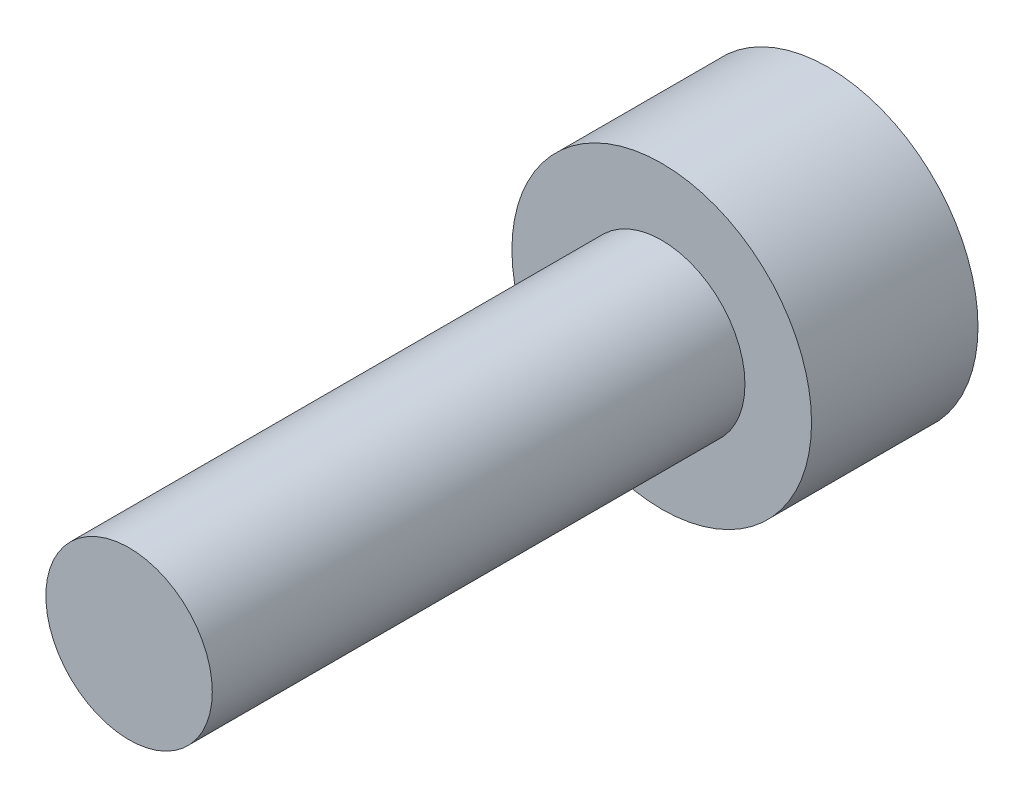
ISO-10303-21;
HEADER;
FILE_DESCRIPTION(('STEP AP214'),'2;1');
FILE_NAME('part.step','',(''),(''),'','','');
FILE_SCHEMA(('AUTOMOTIVE_DESIGN { 1 0 10303 214 1 1 1 1 }'));
ENDSEC;
DATA;
#1=APPLICATION_CONTEXT('core data for automotive mechanical design processes');
#2=APPLICATION_PROTOCOL_DEFINITION('international standard','automotive_design',2000,#1);
#3=PRODUCT_CONTEXT('',#1,'mechanical');
#4=PRODUCT('Part','Part','',(#3));
#5=PRODUCT_RELATED_PRODUCT_CATEGORY('part','',(#4));
#6=PRODUCT_DEFINITION_FORMATION('','',#4);
#7=PRODUCT_DEFINITION_CONTEXT('part definition',#1,'design');
#8=PRODUCT_DEFINITION('design','',#6,#7);
#9=PRODUCT_DEFINITION_SHAPE('','',#8);
#10=(LENGTH_UNIT() NAMED_UNIT(*) SI_UNIT(.MILLI.,.METRE.));
#11=(NAMED_UNIT(*) PLANE_ANGLE_UNIT() SI_UNIT($,.RADIAN.));
#12=(NAMED_UNIT(*) SI_UNIT($,.STERADIAN.) SOLID_ANGLE_UNIT());
#13=UNCERTAINTY_MEASURE_WITH_UNIT(LENGTH_MEASURE(1.E-05),#10,'distance_accuracy_value','');
#14=(GEOMETRIC_REPRESENTATION_CONTEXT(3) GLOBAL_UNCERTAINTY_ASSIGNED_CONTEXT((#13)) GLOBAL_UNIT_ASSIGNED_CONTEXT((#10,
#11,#12)) REPRESENTATION_CONTEXT('',''));
#15=CARTESIAN_POINT('',(0.,0.,0.));
#16=DIRECTION('',(0.,0.,1.));
#17=DIRECTION('',(1.,0.,0.));
#18=AXIS2_PLACEMENT_3D('',#15,#16,#17);
#19=CARTESIAN_POINT('',(0.,0.,2.5));
#20=DIRECTION('',(0.,0.,1.));
#21=DIRECTION('',(1.,0.,0.));
#22=AXIS2_PLACEMENT_3D('',#19,#20,#21);
#23=PLANE('',#22);
#24=CARTESIAN_POINT('',(0.,0.,2.5));
#25=DIRECTION('',(0.,0.,1.));
#26=DIRECTION('',(1.,0.,0.));
#27=AXIS2_PLACEMENT_3D('',#24,#25,#26);
#28=CIRCLE('',#27,2.25);
#29=CARTESIAN_POINT('',(2.25,0.,2.5));
#30=VERTEX_POINT('',#29);
#31=EDGE_CURVE('E11',#30,#30,#28,.T.);
#32=ORIENTED_EDGE('',*,*,#31,.T.);
#33=EDGE_LOOP('',(#32));
#34=FACE_BOUND('',#33,.T.);
#35=CARTESIAN_POINT('',(0.,0.,2.5));
#36=DIRECTION('',(0.,0.,1.));
#37=DIRECTION('',(1.,0.,0.));
#38=AXIS2_PLACEMENT_3D('',#35,#36,#37);
#39=CIRCLE('',#38,1.25);
#40=CARTESIAN_POINT('',(1.25,0.,2.5));
#41=VERTEX_POINT('',#40);
#42=EDGE_CURVE('E139',#41,#41,#39,.T.);
#43=ORIENTED_EDGE('',*,*,#42,.F.);
#44=EDGE_LOOP('',(#43));
#45=FACE_BOUND('',#44,.T.);
#46=ADVANCED_FACE('F37',(#34,#45),#23,.T.);
#47=CARTESIAN_POINT('',(0.,0.,2.5));
#48=DIRECTION('',(0.,0.,-1.));
#49=DIRECTION('',(-1.,0.,0.));
#50=AXIS2_PLACEMENT_3D('',#47,#48,#49);
#51=CYLINDRICAL_SURFACE('',#50,2.25);
#52=ORIENTED_EDGE('',*,*,#31,.F.);
#53=EDGE_LOOP('',(#52));
#54=FACE_BOUND('',#53,.T.);
#55=CARTESIAN_POINT('',(0.,0.,0.));
#56=DIRECTION('',(0.,0.,1.));
#57=DIRECTION('',(1.,0.,0.));
#58=AXIS2_PLACEMENT_3D('',#55,#56,#57);
#59=CIRCLE('',#58,2.25);
#60=CARTESIAN_POINT('',(2.25,0.,0.));
#61=VERTEX_POINT('',#60);
#62=EDGE_CURVE('E41',#61,#61,#59,.T.);
#63=ORIENTED_EDGE('',*,*,#62,.T.);
#64=EDGE_LOOP('',(#63));
#65=FACE_BOUND('',#64,.T.);
#66=ADVANCED_FACE('F39',(#54,#65),#51,.T.);
#67=CARTESIAN_POINT('',(0.,0.,0.));
#68=DIRECTION('',(0.,0.,1.));
#69=DIRECTION('',(1.,0.,0.));
#70=AXIS2_PLACEMENT_3D('',#67,#68,#69);
#71=PLANE('',#70);
#72=DIRECTION('',(-0.205557637970208,0.978645010957553,0.));
#73=VECTOR('',#72,1.);
#74=CARTESIAN_POINT('',(-0.852242502162426,-0.763657678817253,0.));
#75=LINE('',#74,#73);
#76=CARTESIAN_POINT('',(-0.852242502162426,-0.763657678817253,0.));
#77=VERTEX_POINT('',#76);
#78=CARTESIAN_POINT('',(-1.08746820073201,0.356234817648851,0.));
#79=VERTEX_POINT('',#78);
#80=EDGE_CURVE('E126',#77,#79,#75,.T.);
#81=ORIENTED_EDGE('',*,*,#80,.F.);
#82=DIRECTION('',(-0.950310259761245,0.311304369054652,0.));
#83=VECTOR('',#82,1.);
#84=CARTESIAN_POINT('',(0.235225698569587,-1.1198924964661,0.));
#85=LINE('',#84,#83);
#86=CARTESIAN_POINT('',(0.235225698569587,-1.1198924964661,0.));
#87=VERTEX_POINT('',#86);
#88=EDGE_CURVE('E52',#87,#77,#85,.T.);
#89=ORIENTED_EDGE('',*,*,#88,.F.);
#90=DIRECTION('',(-0.744752621791037,-0.667340641902901,0.));
#91=VECTOR('',#90,1.);
#92=CARTESIAN_POINT('',(1.08746820073201,-0.356234817648848,0.));
#93=LINE('',#92,#91);
#94=CARTESIAN_POINT('',(1.08746820073201,-0.356234817648848,0.));
#95=VERTEX_POINT('',#94);
#96=EDGE_CURVE('E135',#95,#87,#93,.T.);
#97=ORIENTED_EDGE('',*,*,#96,.F.);
#98=DIRECTION('',(0.205557637970207,-0.978645010957553,0.));
#99=VECTOR('',#98,1.);
#100=CARTESIAN_POINT('',(0.852242502162427,0.763657678817255,0.));
#101=LINE('',#100,#99);
#102=CARTESIAN_POINT('',(0.852242502162427,0.763657678817255,0.));
#103=VERTEX_POINT('',#102);
#104=EDGE_CURVE('E133',#103,#95,#101,.T.);
#105=ORIENTED_EDGE('',*,*,#104,.F.);
#106=DIRECTION('',(0.950310259761245,-0.311304369054652,0.));
#107=VECTOR('',#106,1.);
#108=CARTESIAN_POINT('',(-0.235225698569587,1.1198924964661,0.));
#109=LINE('',#108,#107);
#110=CARTESIAN_POINT('',(-0.235225698569587,1.1198924964661,0.));
#111=VERTEX_POINT('',#110);
#112=EDGE_CURVE('E100',#111,#103,#109,.T.);
#113=ORIENTED_EDGE('',*,*,#112,.F.);
#114=DIRECTION('',(0.744752621791037,0.667340641902901,0.));
#115=VECTOR('',#114,1.);
#116=CARTESIAN_POINT('',(-1.08746820073201,0.356234817648851,0.));
#117=LINE('',#116,#115);
#118=EDGE_CURVE('E129',#79,#111,#117,.T.);
#119=ORIENTED_EDGE('',*,*,#118,.F.);
#120=EDGE_LOOP('',(#81,#89,#97,#105,#113,#119));
#121=FACE_BOUND('',#120,.T.);
#122=ORIENTED_EDGE('',*,*,#62,.F.);
#123=EDGE_LOOP('',(#122));
#124=FACE_BOUND('',#123,.T.);
#125=ADVANCED_FACE('F159',(#121,#124),#71,.F.);
#126=CARTESIAN_POINT('',(0.,0.,10.5));
#127=DIRECTION('',(0.,0.,-1.));
#128=DIRECTION('',(-1.,0.,0.));
#129=AXIS2_PLACEMENT_3D('',#126,#127,#128);
#130=CYLINDRICAL_SURFACE('',#129,1.25);
#131=CARTESIAN_POINT('',(0.,0.,10.5));
#132=DIRECTION('',(0.,0.,1.));
#133=DIRECTION('',(1.,0.,0.));
#134=AXIS2_PLACEMENT_3D('',#131,#132,#133);
#135=CIRCLE('',#134,1.25);
#136=CARTESIAN_POINT('',(1.25,0.,10.5));
#137=VERTEX_POINT('',#136);
#138=EDGE_CURVE('E145',#137,#137,#135,.T.);
#139=ORIENTED_EDGE('',*,*,#138,.F.);
#140=EDGE_LOOP('',(#139));
#141=FACE_BOUND('',#140,.T.);
#142=ORIENTED_EDGE('',*,*,#42,.T.);
#143=EDGE_LOOP('',(#142));
#144=FACE_BOUND('',#143,.T.);
#145=ADVANCED_FACE('F151',(#141,#144),#130,.T.);
#146=CARTESIAN_POINT('',(0.,0.,10.5));
#147=DIRECTION('',(0.,0.,1.));
#148=DIRECTION('',(1.,0.,0.));
#149=AXIS2_PLACEMENT_3D('',#146,#147,#148);
#150=PLANE('',#149);
#151=ORIENTED_EDGE('',*,*,#138,.T.);
#152=EDGE_LOOP('',(#151));
#153=FACE_BOUND('',#152,.T.);
#154=ADVANCED_FACE('F168',(#153),#150,.T.);
#155=CARTESIAN_POINT('',(0.235225698569587,-1.1198924964661,2.));
#156=DIRECTION('',(-0.311304369054652,-0.950310259761245,0.));
#157=DIRECTION('',(0.950310259761245,-0.311304369054652,0.));
#158=AXIS2_PLACEMENT_3D('',#155,#156,#157);
#159=PLANE('',#158);
#160=ORIENTED_EDGE('',*,*,#88,.T.);
#161=DIRECTION('',(0.,0.,-1.));
#162=VECTOR('',#161,1.);
#163=CARTESIAN_POINT('',(-0.852242502162426,-0.763657678817253,2.));
#164=LINE('',#163,#162);
#165=CARTESIAN_POINT('',(-0.852242502162426,-0.763657678817253,2.));
#166=VERTEX_POINT('',#165);
#167=EDGE_CURVE('E82',#166,#77,#164,.T.);
#168=ORIENTED_EDGE('',*,*,#167,.F.);
#169=DIRECTION('',(-0.950310259761245,0.311304369054652,0.));
#170=VECTOR('',#169,1.);
#171=CARTESIAN_POINT('',(0.235225698569587,-1.1198924964661,2.));
#172=LINE('',#171,#170);
#173=CARTESIAN_POINT('',(0.235225698569587,-1.1198924964661,2.));
#174=VERTEX_POINT('',#173);
#175=EDGE_CURVE('E137',#174,#166,#172,.T.);
#176=ORIENTED_EDGE('',*,*,#175,.F.);
#177=DIRECTION('',(0.,0.,-1.));
#178=VECTOR('',#177,1.);
#179=CARTESIAN_POINT('',(0.235225698569587,-1.1198924964661,2.));
#180=LINE('',#179,#178);
#181=EDGE_CURVE('E60',#174,#87,#180,.T.);
#182=ORIENTED_EDGE('',*,*,#181,.T.);
#183=EDGE_LOOP('',(#160,#168,#176,#182));
#184=FACE_BOUND('',#183,.T.);
#185=ADVANCED_FACE('F180',(#184),#159,.F.);
#186=CARTESIAN_POINT('',(1.08746820073201,-0.356234817648848,2.));
#187=DIRECTION('',(0.667340641902901,-0.744752621791037,0.));
#188=DIRECTION('',(0.744752621791037,0.667340641902901,0.));
#189=AXIS2_PLACEMENT_3D('',#186,#187,#188);
#190=PLANE('',#189);
#191=ORIENTED_EDGE('',*,*,#96,.T.);
#192=ORIENTED_EDGE('',*,*,#181,.F.);
#193=DIRECTION('',(-0.744752621791037,-0.667340641902901,0.));
#194=VECTOR('',#193,1.);
#195=CARTESIAN_POINT('',(1.08746820073201,-0.356234817648848,2.));
#196=LINE('',#195,#194);
#197=CARTESIAN_POINT('',(1.08746820073201,-0.356234817648848,2.));
#198=VERTEX_POINT('',#197);
#199=EDGE_CURVE('E112',#198,#174,#196,.T.);
#200=ORIENTED_EDGE('',*,*,#199,.F.);
#201=DIRECTION('',(0.,0.,-1.));
#202=VECTOR('',#201,1.);
#203=CARTESIAN_POINT('',(1.08746820073201,-0.356234817648848,2.));
#204=LINE('',#203,#202);
#205=EDGE_CURVE('E104',#198,#95,#204,.T.);
#206=ORIENTED_EDGE('',*,*,#205,.T.);
#207=EDGE_LOOP('',(#191,#192,#200,#206));
#208=FACE_BOUND('',#207,.T.);
#209=ADVANCED_FACE('F182',(#208),#190,.F.);
#210=CARTESIAN_POINT('',(0.852242502162427,0.763657678817255,2.));
#211=DIRECTION('',(0.978645010957553,0.205557637970207,0.));
#212=DIRECTION('',(-0.205557637970207,0.978645010957553,0.));
#213=AXIS2_PLACEMENT_3D('',#210,#211,#212);
#214=PLANE('',#213);
#215=ORIENTED_EDGE('',*,*,#104,.T.);
#216=ORIENTED_EDGE('',*,*,#205,.F.);
#217=DIRECTION('',(0.205557637970207,-0.978645010957553,0.));
#218=VECTOR('',#217,1.);
#219=CARTESIAN_POINT('',(0.852242502162427,0.763657678817255,2.));
#220=LINE('',#219,#218);
#221=CARTESIAN_POINT('',(0.852242502162427,0.763657678817255,2.));
#222=VERTEX_POINT('',#221);
#223=EDGE_CURVE('E108',#222,#198,#220,.T.);
#224=ORIENTED_EDGE('',*,*,#223,.F.);
#225=DIRECTION('',(0.,0.,-1.));
#226=VECTOR('',#225,1.);
#227=CARTESIAN_POINT('',(0.852242502162427,0.763657678817255,2.));
#228=LINE('',#227,#226);
#229=EDGE_CURVE('E93',#222,#103,#228,.T.);
#230=ORIENTED_EDGE('',*,*,#229,.T.);
#231=EDGE_LOOP('',(#215,#216,#224,#230));
#232=FACE_BOUND('',#231,.T.);
#233=ADVANCED_FACE('F109',(#232),#214,.F.);
#234=CARTESIAN_POINT('',(-0.235225698569587,1.1198924964661,2.));
#235=DIRECTION('',(0.311304369054652,0.950310259761245,0.));
#236=DIRECTION('',(-0.950310259761245,0.311304369054652,0.));
#237=AXIS2_PLACEMENT_3D('',#234,#235,#236);
#238=PLANE('',#237);
#239=ORIENTED_EDGE('',*,*,#112,.T.);
#240=ORIENTED_EDGE('',*,*,#229,.F.);
#241=DIRECTION('',(0.950310259761245,-0.311304369054652,0.));
#242=VECTOR('',#241,1.);
#243=CARTESIAN_POINT('',(-0.235225698569587,1.1198924964661,2.));
#244=LINE('',#243,#242);
#245=CARTESIAN_POINT('',(-0.235225698569587,1.1198924964661,2.));
#246=VERTEX_POINT('',#245);
#247=EDGE_CURVE('E97',#246,#222,#244,.T.);
#248=ORIENTED_EDGE('',*,*,#247,.F.);
#249=DIRECTION('',(0.,0.,-1.));
#250=VECTOR('',#249,1.);
#251=CARTESIAN_POINT('',(-0.235225698569587,1.1198924964661,2.));
#252=LINE('',#251,#250);
#253=EDGE_CURVE('E105',#246,#111,#252,.T.);
#254=ORIENTED_EDGE('',*,*,#253,.T.);
#255=EDGE_LOOP('',(#239,#240,#248,#254));
#256=FACE_BOUND('',#255,.T.);
#257=ADVANCED_FACE('F95',(#256),#238,.F.);
#258=CARTESIAN_POINT('',(-1.08746820073201,0.356234817648851,2.));
#259=DIRECTION('',(-0.667340641902901,0.744752621791037,0.));
#260=DIRECTION('',(-0.744752621791038,-0.667340641902901,0.));
#261=AXIS2_PLACEMENT_3D('',#258,#259,#260);
#262=PLANE('',#261);
#263=ORIENTED_EDGE('',*,*,#118,.T.);
#264=ORIENTED_EDGE('',*,*,#253,.F.);
#265=DIRECTION('',(0.744752621791037,0.667340641902901,0.));
#266=VECTOR('',#265,1.);
#267=CARTESIAN_POINT('',(-1.08746820073201,0.356234817648851,2.));
#268=LINE('',#267,#266);
#269=CARTESIAN_POINT('',(-1.08746820073201,0.356234817648851,2.));
#270=VERTEX_POINT('',#269);
#271=EDGE_CURVE('E118',#270,#246,#268,.T.);
#272=ORIENTED_EDGE('',*,*,#271,.F.);
#273=DIRECTION('',(0.,0.,-1.));
#274=VECTOR('',#273,1.);
#275=CARTESIAN_POINT('',(-1.08746820073201,0.356234817648851,2.));
#276=LINE('',#275,#274);
#277=EDGE_CURVE('E142',#270,#79,#276,.T.);
#278=ORIENTED_EDGE('',*,*,#277,.T.);
#279=EDGE_LOOP('',(#263,#264,#272,#278));
#280=FACE_BOUND('',#279,.T.);
#281=ADVANCED_FACE('F193',(#280),#262,.F.);
#282=CARTESIAN_POINT('',(-0.852242502162426,-0.763657678817253,2.));
#283=DIRECTION('',(-0.978645010957553,-0.205557637970208,0.));
#284=DIRECTION('',(0.205557637970208,-0.978645010957553,0.));
#285=AXIS2_PLACEMENT_3D('',#282,#283,#284);
#286=PLANE('',#285);
#287=ORIENTED_EDGE('',*,*,#80,.T.);
#288=ORIENTED_EDGE('',*,*,#277,.F.);
#289=DIRECTION('',(-0.205557637970208,0.978645010957553,0.));
#290=VECTOR('',#289,1.);
#291=CARTESIAN_POINT('',(-0.852242502162426,-0.763657678817253,2.));
#292=LINE('',#291,#290);
#293=EDGE_CURVE('E120',#166,#270,#292,.T.);
#294=ORIENTED_EDGE('',*,*,#293,.F.);
#295=ORIENTED_EDGE('',*,*,#167,.T.);
#296=EDGE_LOOP('',(#287,#288,#294,#295));
#297=FACE_BOUND('',#296,.T.);
#298=ADVANCED_FACE('F178',(#297),#286,.F.);
#299=CARTESIAN_POINT('',(0.,0.,2.));
#300=DIRECTION('',(0.,0.,-1.));
#301=DIRECTION('',(-1.,0.,0.));
#302=AXIS2_PLACEMENT_3D('',#299,#300,#301);
#303=PLANE('',#302);
#304=ORIENTED_EDGE('',*,*,#175,.T.);
#305=ORIENTED_EDGE('',*,*,#293,.T.);
#306=ORIENTED_EDGE('',*,*,#271,.T.);
#307=ORIENTED_EDGE('',*,*,#247,.T.);
#308=ORIENTED_EDGE('',*,*,#223,.T.);
#309=ORIENTED_EDGE('',*,*,#199,.T.);
#310=EDGE_LOOP('',(#304,#305,#306,#307,#308,#309));
#311=FACE_BOUND('',#310,.T.);
#312=ADVANCED_FACE('F115',(#311),#303,.T.);
#313=CLOSED_SHELL('',(#46,#66,#125,#145,#154,#185,#209,#233,#257,#281,#298,#312));
#314=MANIFOLD_SOLID_BREP('B2',#313);
#315=ADVANCED_BREP_SHAPE_REPRESENTATION('',(#18,#314),#14);
#316=SHAPE_DEFINITION_REPRESENTATION(#9,#315);
ENDSEC;
END-ISO-10303-21;
